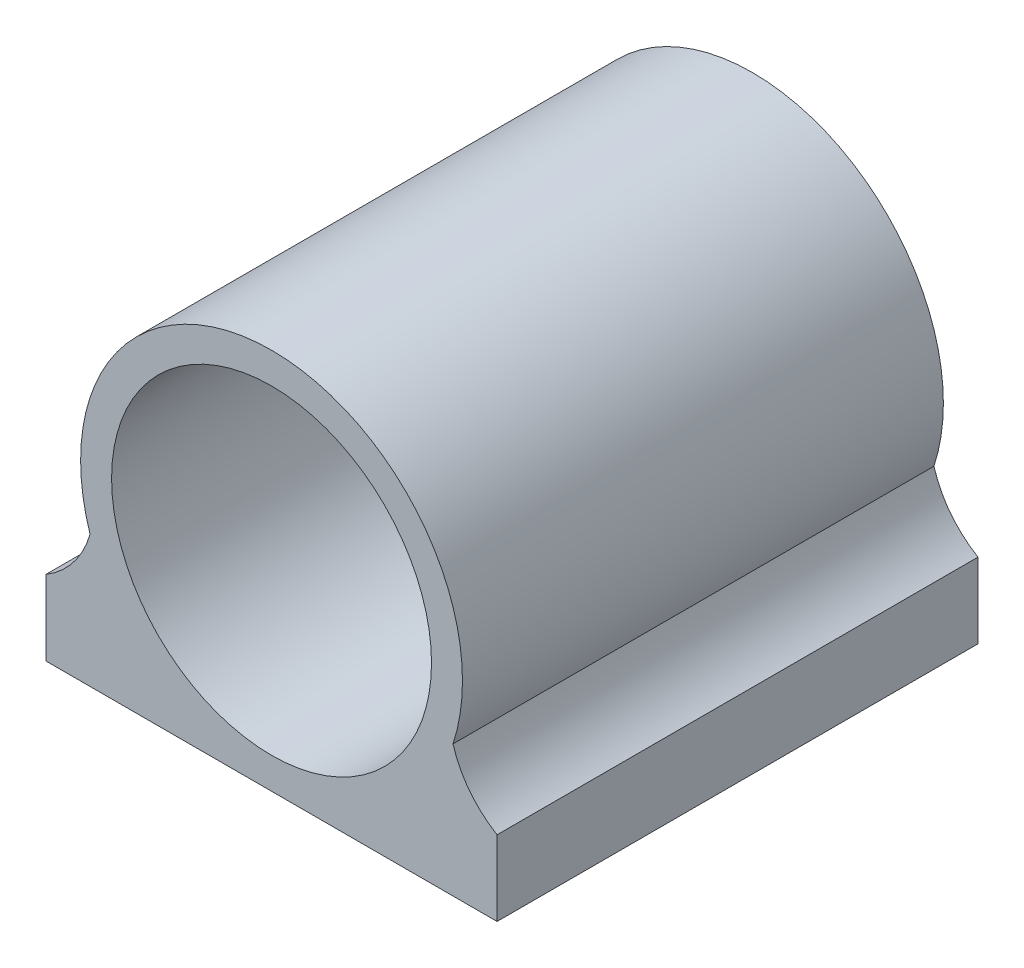
ISO-10303-21;
HEADER;
FILE_DESCRIPTION(('STEP AP214'),'2;1');
FILE_NAME('part.step','',(''),(''),'','','');
FILE_SCHEMA(('AUTOMOTIVE_DESIGN { 1 0 10303 214 1 1 1 1 }'));
ENDSEC;
DATA;
#1=APPLICATION_CONTEXT('core data for automotive mechanical design processes');
#2=APPLICATION_PROTOCOL_DEFINITION('international standard','automotive_design',2000,#1);
#3=PRODUCT_CONTEXT('',#1,'mechanical');
#4=PRODUCT('Part','Part','',(#3));
#5=PRODUCT_RELATED_PRODUCT_CATEGORY('part','',(#4));
#6=PRODUCT_DEFINITION_FORMATION('','',#4);
#7=PRODUCT_DEFINITION_CONTEXT('part definition',#1,'design');
#8=PRODUCT_DEFINITION('design','',#6,#7);
#9=PRODUCT_DEFINITION_SHAPE('','',#8);
#10=(LENGTH_UNIT() NAMED_UNIT(*) SI_UNIT(.MILLI.,.METRE.));
#11=(NAMED_UNIT(*) PLANE_ANGLE_UNIT() SI_UNIT($,.RADIAN.));
#12=(NAMED_UNIT(*) SI_UNIT($,.STERADIAN.) SOLID_ANGLE_UNIT());
#13=UNCERTAINTY_MEASURE_WITH_UNIT(LENGTH_MEASURE(1.E-05),#10,'distance_accuracy_value','');
#14=(GEOMETRIC_REPRESENTATION_CONTEXT(3) GLOBAL_UNCERTAINTY_ASSIGNED_CONTEXT((#13)) GLOBAL_UNIT_ASSIGNED_CONTEXT((#10,
#11,#12)) REPRESENTATION_CONTEXT('',''));
#15=CARTESIAN_POINT('',(0.,0.,0.));
#16=DIRECTION('',(0.,0.,1.));
#17=DIRECTION('',(1.,0.,0.));
#18=AXIS2_PLACEMENT_3D('',#15,#16,#17);
#19=CARTESIAN_POINT('',(0.,0.,46.6));
#20=DIRECTION('',(0.,0.,1.));
#21=DIRECTION('',(1.,0.,0.));
#22=AXIS2_PLACEMENT_3D('',#19,#20,#21);
#23=PLANE('',#22);
#24=CARTESIAN_POINT('',(0.,0.,46.6));
#25=DIRECTION('',(0.,0.,1.));
#26=DIRECTION('',(1.,0.,0.));
#27=AXIS2_PLACEMENT_3D('',#24,#25,#26);
#28=CIRCLE('',#27,15.5);
#29=CARTESIAN_POINT('',(15.5,0.,46.6));
#30=VERTEX_POINT('',#29);
#31=EDGE_CURVE('E131',#30,#30,#28,.T.);
#32=ORIENTED_EDGE('',*,*,#31,.F.);
#33=EDGE_LOOP('',(#32));
#34=FACE_BOUND('',#33,.T.);
#35=DIRECTION('',(0.,1.,0.));
#36=VECTOR('',#35,1.);
#37=CARTESIAN_POINT('',(21.8547805163235,-5.74617194400968,46.6));
#38=LINE('',#37,#36);
#39=CARTESIAN_POINT('',(21.8547805163235,-18.5142505145412,46.6));
#40=VERTEX_POINT('',#39);
#41=CARTESIAN_POINT('',(21.8547805163235,-11.2371657357457,46.6));
#42=VERTEX_POINT('',#41);
#43=EDGE_CURVE('E119',#40,#42,#38,.T.);
#44=ORIENTED_EDGE('',*,*,#43,.T.);
#45=CARTESIAN_POINT('',(26.6714099908641,-3.08615393964499,46.6));
#46=DIRECTION('',(0.,0.,1.));
#47=DIRECTION('',(1.,0.,0.));
#48=AXIS2_PLACEMENT_3D('',#45,#46,#47);
#49=CIRCLE('',#48,9.46778288699033);
#50=CARTESIAN_POINT('',(17.5849796130071,-5.74617194400968,46.6));
#51=VERTEX_POINT('',#50);
#52=EDGE_CURVE('E102',#42,#51,#49,.F.);
#53=ORIENTED_EDGE('',*,*,#52,.T.);
#54=CARTESIAN_POINT('',(0.,0.,46.6));
#55=DIRECTION('',(0.,0.,1.));
#56=DIRECTION('',(1.,0.,0.));
#57=AXIS2_PLACEMENT_3D('',#54,#55,#56);
#58=CIRCLE('',#57,18.5);
#59=CARTESIAN_POINT('',(-17.5849796130071,-5.74617194400968,46.6));
#60=VERTEX_POINT('',#59);
#61=EDGE_CURVE('E136',#51,#60,#58,.T.);
#62=ORIENTED_EDGE('',*,*,#61,.T.);
#63=CARTESIAN_POINT('',(-26.6714099908641,-3.08615393964499,46.6));
#64=DIRECTION('',(0.,0.,1.));
#65=DIRECTION('',(1.,0.,0.));
#66=AXIS2_PLACEMENT_3D('',#63,#64,#65);
#67=CIRCLE('',#66,9.46778288699033);
#68=CARTESIAN_POINT('',(-21.8547805163235,-11.2371657357457,46.6));
#69=VERTEX_POINT('',#68);
#70=EDGE_CURVE('E111',#69,#60,#67,.T.);
#71=ORIENTED_EDGE('',*,*,#70,.F.);
#72=DIRECTION('',(0.,-1.,0.));
#73=VECTOR('',#72,1.);
#74=CARTESIAN_POINT('',(-21.8547805163235,-5.74617194400969,46.6));
#75=LINE('',#74,#73);
#76=CARTESIAN_POINT('',(-21.8547805163235,-18.5142505145412,46.6));
#77=VERTEX_POINT('',#76);
#78=EDGE_CURVE('E91',#69,#77,#75,.T.);
#79=ORIENTED_EDGE('',*,*,#78,.T.);
#80=DIRECTION('',(1.,0.,0.));
#81=VECTOR('',#80,1.);
#82=CARTESIAN_POINT('',(-21.8547805163235,-18.5142505145412,46.6));
#83=LINE('',#82,#81);
#84=EDGE_CURVE('E117',#77,#40,#83,.T.);
#85=ORIENTED_EDGE('',*,*,#84,.T.);
#86=EDGE_LOOP('',(#44,#53,#62,#71,#79,#85));
#87=FACE_BOUND('',#86,.T.);
#88=ADVANCED_FACE('F33',(#34,#87),#23,.T.);
#89=CARTESIAN_POINT('',(0.,0.,0.));
#90=DIRECTION('',(0.,0.,1.));
#91=DIRECTION('',(1.,0.,0.));
#92=AXIS2_PLACEMENT_3D('',#89,#90,#91);
#93=PLANE('',#92);
#94=CARTESIAN_POINT('',(0.,0.,0.));
#95=DIRECTION('',(0.,0.,1.));
#96=DIRECTION('',(1.,0.,0.));
#97=AXIS2_PLACEMENT_3D('',#94,#95,#96);
#98=CIRCLE('',#97,15.5);
#99=CARTESIAN_POINT('',(15.5,0.,0.));
#100=VERTEX_POINT('',#99);
#101=EDGE_CURVE('E130',#100,#100,#98,.T.);
#102=ORIENTED_EDGE('',*,*,#101,.T.);
#103=EDGE_LOOP('',(#102));
#104=FACE_BOUND('',#103,.T.);
#105=CARTESIAN_POINT('',(26.6714099908641,-3.08615393964499,0.));
#106=DIRECTION('',(0.,0.,1.));
#107=DIRECTION('',(1.,0.,0.));
#108=AXIS2_PLACEMENT_3D('',#105,#106,#107);
#109=CIRCLE('',#108,9.46778288699033);
#110=CARTESIAN_POINT('',(21.8547805163235,-11.2371657357457,0.));
#111=VERTEX_POINT('',#110);
#112=CARTESIAN_POINT('',(17.5849796130071,-5.74617194400968,0.));
#113=VERTEX_POINT('',#112);
#114=EDGE_CURVE('E95',#111,#113,#109,.F.);
#115=ORIENTED_EDGE('',*,*,#114,.F.);
#116=DIRECTION('',(0.,1.,0.));
#117=VECTOR('',#116,1.);
#118=CARTESIAN_POINT('',(21.8547805163235,-5.74617194400968,0.));
#119=LINE('',#118,#117);
#120=CARTESIAN_POINT('',(21.8547805163235,-18.5142505145412,0.));
#121=VERTEX_POINT('',#120);
#122=EDGE_CURVE('E84',#121,#111,#119,.T.);
#123=ORIENTED_EDGE('',*,*,#122,.F.);
#124=DIRECTION('',(1.,0.,0.));
#125=VECTOR('',#124,1.);
#126=CARTESIAN_POINT('',(-21.8547805163235,-18.5142505145412,0.));
#127=LINE('',#126,#125);
#128=CARTESIAN_POINT('',(-21.8547805163235,-18.5142505145412,0.));
#129=VERTEX_POINT('',#128);
#130=EDGE_CURVE('E92',#129,#121,#127,.T.);
#131=ORIENTED_EDGE('',*,*,#130,.F.);
#132=DIRECTION('',(0.,-1.,0.));
#133=VECTOR('',#132,1.);
#134=CARTESIAN_POINT('',(-21.8547805163235,-5.74617194400969,0.));
#135=LINE('',#134,#133);
#136=CARTESIAN_POINT('',(-21.8547805163235,-11.2371657357457,0.));
#137=VERTEX_POINT('',#136);
#138=EDGE_CURVE('E115',#137,#129,#135,.T.);
#139=ORIENTED_EDGE('',*,*,#138,.F.);
#140=CARTESIAN_POINT('',(-26.6714099908641,-3.08615393964499,0.));
#141=DIRECTION('',(0.,0.,1.));
#142=DIRECTION('',(1.,0.,0.));
#143=AXIS2_PLACEMENT_3D('',#140,#141,#142);
#144=CIRCLE('',#143,9.46778288699033);
#145=CARTESIAN_POINT('',(-17.5849796130071,-5.74617194400968,0.));
#146=VERTEX_POINT('',#145);
#147=EDGE_CURVE('E54',#137,#146,#144,.T.);
#148=ORIENTED_EDGE('',*,*,#147,.T.);
#149=CARTESIAN_POINT('',(0.,0.,0.));
#150=DIRECTION('',(0.,0.,1.));
#151=DIRECTION('',(1.,0.,0.));
#152=AXIS2_PLACEMENT_3D('',#149,#150,#151);
#153=CIRCLE('',#152,18.5);
#154=EDGE_CURVE('E98',#113,#146,#153,.T.);
#155=ORIENTED_EDGE('',*,*,#154,.F.);
#156=EDGE_LOOP('',(#115,#123,#131,#139,#148,#155));
#157=FACE_BOUND('',#156,.T.);
#158=ADVANCED_FACE('F96',(#104,#157),#93,.F.);
#159=CARTESIAN_POINT('',(21.8547805163235,-5.74617194400968,46.6));
#160=DIRECTION('',(-1.,0.,0.));
#161=DIRECTION('',(0.,-1.,0.));
#162=AXIS2_PLACEMENT_3D('',#159,#160,#161);
#163=PLANE('',#162);
#164=DIRECTION('',(0.,0.,-1.));
#165=VECTOR('',#164,1.);
#166=CARTESIAN_POINT('',(21.8547805163235,-11.2371657357457,150.54826368576));
#167=LINE('',#166,#165);
#168=EDGE_CURVE('E11',#42,#111,#167,.T.);
#169=ORIENTED_EDGE('',*,*,#168,.F.);
#170=ORIENTED_EDGE('',*,*,#43,.F.);
#171=DIRECTION('',(0.,0.,-1.));
#172=VECTOR('',#171,1.);
#173=CARTESIAN_POINT('',(21.8547805163235,-18.5142505145412,46.6));
#174=LINE('',#173,#172);
#175=EDGE_CURVE('E88',#40,#121,#174,.T.);
#176=ORIENTED_EDGE('',*,*,#175,.T.);
#177=ORIENTED_EDGE('',*,*,#122,.T.);
#178=EDGE_LOOP('',(#169,#170,#176,#177));
#179=FACE_BOUND('',#178,.T.);
#180=ADVANCED_FACE('F86',(#179),#163,.F.);
#181=CARTESIAN_POINT('',(0.,0.,46.6));
#182=DIRECTION('',(0.,0.,-1.));
#183=DIRECTION('',(-1.,0.,0.));
#184=AXIS2_PLACEMENT_3D('',#181,#182,#183);
#185=CYLINDRICAL_SURFACE('',#184,18.5);
#186=DIRECTION('',(0.,0.,-1.));
#187=VECTOR('',#186,1.);
#188=CARTESIAN_POINT('',(-17.5849796130071,-5.74617194400969,46.6));
#189=LINE('',#188,#187);
#190=EDGE_CURVE('E128',#60,#146,#189,.T.);
#191=ORIENTED_EDGE('',*,*,#190,.F.);
#192=ORIENTED_EDGE('',*,*,#61,.F.);
#193=DIRECTION('',(0.,0.,-1.));
#194=VECTOR('',#193,1.);
#195=CARTESIAN_POINT('',(17.5849796130071,-5.74617194400968,46.6));
#196=LINE('',#195,#194);
#197=EDGE_CURVE('E106',#113,#51,#196,.F.);
#198=ORIENTED_EDGE('',*,*,#197,.F.);
#199=ORIENTED_EDGE('',*,*,#154,.T.);
#200=EDGE_LOOP('',(#191,#192,#198,#199));
#201=FACE_BOUND('',#200,.T.);
#202=ADVANCED_FACE('F35',(#201),#185,.T.);
#203=CARTESIAN_POINT('',(0.,0.,46.6));
#204=DIRECTION('',(0.,0.,-1.));
#205=DIRECTION('',(-1.,0.,0.));
#206=AXIS2_PLACEMENT_3D('',#203,#204,#205);
#207=CYLINDRICAL_SURFACE('',#206,15.5);
#208=ORIENTED_EDGE('',*,*,#101,.F.);
#209=EDGE_LOOP('',(#208));
#210=FACE_BOUND('',#209,.T.);
#211=ORIENTED_EDGE('',*,*,#31,.T.);
#212=EDGE_LOOP('',(#211));
#213=FACE_BOUND('',#212,.T.);
#214=ADVANCED_FACE('F151',(#210,#213),#207,.F.);
#215=CARTESIAN_POINT('',(-21.8547805163235,-5.74617194400969,46.6));
#216=DIRECTION('',(1.,0.,0.));
#217=DIRECTION('',(0.,0.,-1.));
#218=AXIS2_PLACEMENT_3D('',#215,#216,#217);
#219=PLANE('',#218);
#220=ORIENTED_EDGE('',*,*,#78,.F.);
#221=DIRECTION('',(0.,0.,-1.));
#222=VECTOR('',#221,1.);
#223=CARTESIAN_POINT('',(-21.8547805163235,-11.2371657357457,150.54826368576));
#224=LINE('',#223,#222);
#225=EDGE_CURVE('E41',#69,#137,#224,.T.);
#226=ORIENTED_EDGE('',*,*,#225,.T.);
#227=ORIENTED_EDGE('',*,*,#138,.T.);
#228=DIRECTION('',(0.,0.,-1.));
#229=VECTOR('',#228,1.);
#230=CARTESIAN_POINT('',(-21.8547805163235,-18.5142505145412,46.6));
#231=LINE('',#230,#229);
#232=EDGE_CURVE('E124',#77,#129,#231,.T.);
#233=ORIENTED_EDGE('',*,*,#232,.F.);
#234=EDGE_LOOP('',(#220,#226,#227,#233));
#235=FACE_BOUND('',#234,.T.);
#236=ADVANCED_FACE('F141',(#235),#219,.F.);
#237=CARTESIAN_POINT('',(-21.8547805163235,-18.5142505145412,46.6));
#238=DIRECTION('',(0.,1.,0.));
#239=DIRECTION('',(-1.,0.,0.));
#240=AXIS2_PLACEMENT_3D('',#237,#238,#239);
#241=PLANE('',#240);
#242=ORIENTED_EDGE('',*,*,#130,.T.);
#243=ORIENTED_EDGE('',*,*,#175,.F.);
#244=ORIENTED_EDGE('',*,*,#84,.F.);
#245=ORIENTED_EDGE('',*,*,#232,.T.);
#246=EDGE_LOOP('',(#242,#243,#244,#245));
#247=FACE_BOUND('',#246,.T.);
#248=ADVANCED_FACE('F146',(#247),#241,.F.);
#249=CARTESIAN_POINT('',(-26.6714099908641,-3.08615393964499,150.54826368576));
#250=DIRECTION('',(0.,0.,-1.));
#251=DIRECTION('',(-1.,0.,0.));
#252=AXIS2_PLACEMENT_3D('',#249,#250,#251);
#253=CYLINDRICAL_SURFACE('',#252,9.46778288699033);
#254=ORIENTED_EDGE('',*,*,#225,.F.);
#255=ORIENTED_EDGE('',*,*,#70,.T.);
#256=ORIENTED_EDGE('',*,*,#190,.T.);
#257=ORIENTED_EDGE('',*,*,#147,.F.);
#258=EDGE_LOOP('',(#254,#255,#256,#257));
#259=FACE_BOUND('',#258,.T.);
#260=ADVANCED_FACE('F148',(#259),#253,.F.);
#261=CARTESIAN_POINT('',(26.6714099908641,-3.08615393964499,150.54826368576));
#262=DIRECTION('',(0.,0.,-1.));
#263=DIRECTION('',(-1.,0.,0.));
#264=AXIS2_PLACEMENT_3D('',#261,#262,#263);
#265=CYLINDRICAL_SURFACE('',#264,9.46778288699033);
#266=ORIENTED_EDGE('',*,*,#52,.F.);
#267=ORIENTED_EDGE('',*,*,#168,.T.);
#268=ORIENTED_EDGE('',*,*,#114,.T.);
#269=ORIENTED_EDGE('',*,*,#197,.T.);
#270=EDGE_LOOP('',(#266,#267,#268,#269));
#271=FACE_BOUND('',#270,.T.);
#272=ADVANCED_FACE('F105',(#271),#265,.F.);
#273=CLOSED_SHELL('',(#88,#158,#180,#202,#214,#236,#248,#260,#272));
#274=MANIFOLD_SOLID_BREP('B2',#273);
#275=ADVANCED_BREP_SHAPE_REPRESENTATION('',(#18,#274),#14);
#276=SHAPE_DEFINITION_REPRESENTATION(#9,#275);
ENDSEC;
END-ISO-10303-21;
